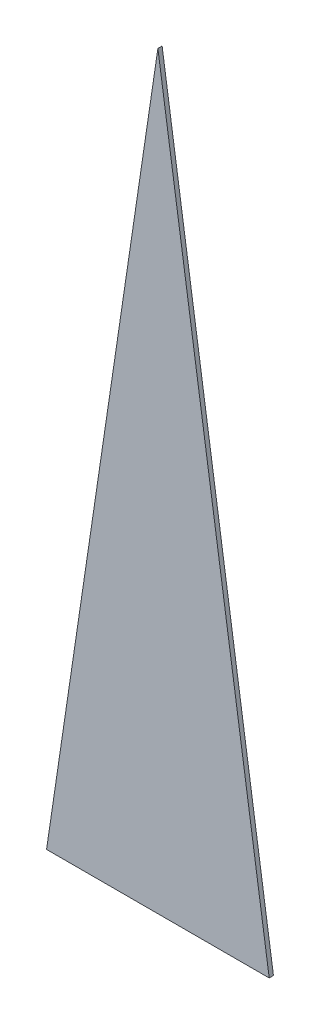
ISO-10303-21;
HEADER;
FILE_DESCRIPTION(('STEP AP214'),'2;1');
FILE_NAME('part.step','',(''),(''),'','','');
FILE_SCHEMA(('AUTOMOTIVE_DESIGN { 1 0 10303 214 1 1 1 1 }'));
ENDSEC;
DATA;
#1=APPLICATION_CONTEXT('core data for automotive mechanical design processes');
#2=APPLICATION_PROTOCOL_DEFINITION('international standard','automotive_design',2000,#1);
#3=PRODUCT_CONTEXT('',#1,'mechanical');
#4=PRODUCT('Part','Part','',(#3));
#5=PRODUCT_RELATED_PRODUCT_CATEGORY('part','',(#4));
#6=PRODUCT_DEFINITION_FORMATION('','',#4);
#7=PRODUCT_DEFINITION_CONTEXT('part definition',#1,'design');
#8=PRODUCT_DEFINITION('design','',#6,#7);
#9=PRODUCT_DEFINITION_SHAPE('','',#8);
#10=(LENGTH_UNIT() NAMED_UNIT(*) SI_UNIT(.MILLI.,.METRE.));
#11=(NAMED_UNIT(*) PLANE_ANGLE_UNIT() SI_UNIT($,.RADIAN.));
#12=(NAMED_UNIT(*) SI_UNIT($,.STERADIAN.) SOLID_ANGLE_UNIT());
#13=UNCERTAINTY_MEASURE_WITH_UNIT(LENGTH_MEASURE(1.E-05),#10,'distance_accuracy_value','');
#14=(GEOMETRIC_REPRESENTATION_CONTEXT(3) GLOBAL_UNCERTAINTY_ASSIGNED_CONTEXT((#13)) GLOBAL_UNIT_ASSIGNED_CONTEXT((#10,
#11,#12)) REPRESENTATION_CONTEXT('',''));
#15=CARTESIAN_POINT('',(0.,0.,0.));
#16=DIRECTION('',(0.,0.,1.));
#17=DIRECTION('',(1.,0.,0.));
#18=AXIS2_PLACEMENT_3D('',#15,#16,#17);
#19=CARTESIAN_POINT('',(0.,0.,0.));
#20=DIRECTION('',(0.,0.,-1.));
#21=DIRECTION('',(-1.,0.,0.));
#22=AXIS2_PLACEMENT_3D('',#19,#20,#21);
#23=PLANE('',#22);
#24=DIRECTION('',(1.,0.,0.));
#25=VECTOR('',#24,1.);
#26=CARTESIAN_POINT('',(-26.305,-177.056620816619,0.));
#27=LINE('',#26,#25);
#28=CARTESIAN_POINT('',(26.305,-177.056620816619,0.));
#29=VERTEX_POINT('',#28);
#30=CARTESIAN_POINT('',(-26.305,-177.056620816619,0.));
#31=VERTEX_POINT('',#30);
#32=EDGE_CURVE('E19',#29,#31,#27,.F.);
#33=ORIENTED_EDGE('',*,*,#32,.T.);
#34=DIRECTION('',(0.14695530726257,0.989143133053737,0.));
#35=VECTOR('',#34,1.);
#36=CARTESIAN_POINT('',(0.,0.,0.));
#37=LINE('',#36,#35);
#38=CARTESIAN_POINT('',(0.,0.,0.));
#39=VERTEX_POINT('',#38);
#40=EDGE_CURVE('E53',#31,#39,#37,.T.);
#41=ORIENTED_EDGE('',*,*,#40,.T.);
#42=DIRECTION('',(0.14695530726257,-0.989143133053737,0.));
#43=VECTOR('',#42,1.);
#44=CARTESIAN_POINT('',(26.305,-177.056620816619,0.));
#45=LINE('',#44,#43);
#46=EDGE_CURVE('E54',#39,#29,#45,.T.);
#47=ORIENTED_EDGE('',*,*,#46,.T.);
#48=EDGE_LOOP('',(#33,#41,#47));
#49=FACE_BOUND('',#48,.T.);
#50=ADVANCED_FACE('F16',(#49),#23,.T.);
#51=CARTESIAN_POINT('',(-26.305,-177.056620816619,1.));
#52=DIRECTION('',(0.,1.,0.));
#53=DIRECTION('',(0.,0.,1.));
#54=AXIS2_PLACEMENT_3D('',#51,#52,#53);
#55=PLANE('',#54);
#56=DIRECTION('',(0.,0.,1.));
#57=VECTOR('',#56,1.);
#58=CARTESIAN_POINT('',(26.305,-177.056620816619,1.));
#59=LINE('',#58,#57);
#60=CARTESIAN_POINT('',(26.305,-177.056620816619,1.));
#61=VERTEX_POINT('',#60);
#62=EDGE_CURVE('E60',#29,#61,#59,.T.);
#63=ORIENTED_EDGE('',*,*,#62,.T.);
#64=DIRECTION('',(-1.,0.,0.));
#65=VECTOR('',#64,1.);
#66=CARTESIAN_POINT('',(0.,-177.056620816619,1.));
#67=LINE('',#66,#65);
#68=CARTESIAN_POINT('',(-26.305,-177.056620816619,1.));
#69=VERTEX_POINT('',#68);
#70=EDGE_CURVE('E64',#61,#69,#67,.T.);
#71=ORIENTED_EDGE('',*,*,#70,.T.);
#72=DIRECTION('',(0.,0.,1.));
#73=VECTOR('',#72,1.);
#74=CARTESIAN_POINT('',(-26.305,-177.056620816619,1.));
#75=LINE('',#74,#73);
#76=EDGE_CURVE('E55',#69,#31,#75,.F.);
#77=ORIENTED_EDGE('',*,*,#76,.T.);
#78=ORIENTED_EDGE('',*,*,#32,.F.);
#79=EDGE_LOOP('',(#63,#71,#77,#78));
#80=FACE_BOUND('',#79,.T.);
#81=ADVANCED_FACE('F63',(#80),#55,.F.);
#82=CARTESIAN_POINT('',(0.,0.,1.));
#83=DIRECTION('',(0.989143133053737,-0.14695530726257,0.));
#84=DIRECTION('',(0.14695530726257,0.989143133053737,0.));
#85=AXIS2_PLACEMENT_3D('',#82,#83,#84);
#86=PLANE('',#85);
#87=ORIENTED_EDGE('',*,*,#76,.F.);
#88=DIRECTION('',(0.14695530726257,0.989143133053737,0.));
#89=VECTOR('',#88,1.);
#90=CARTESIAN_POINT('',(-26.305,-177.056620816619,1.));
#91=LINE('',#90,#89);
#92=CARTESIAN_POINT('',(0.,1.12233147916488E-13,1.));
#93=VERTEX_POINT('',#92);
#94=EDGE_CURVE('E25',#69,#93,#91,.T.);
#95=ORIENTED_EDGE('',*,*,#94,.T.);
#96=DIRECTION('',(0.,0.,1.));
#97=VECTOR('',#96,1.);
#98=CARTESIAN_POINT('',(0.,0.,1.));
#99=LINE('',#98,#97);
#100=EDGE_CURVE('E33',#93,#39,#99,.F.);
#101=ORIENTED_EDGE('',*,*,#100,.T.);
#102=ORIENTED_EDGE('',*,*,#40,.F.);
#103=EDGE_LOOP('',(#87,#95,#101,#102));
#104=FACE_BOUND('',#103,.T.);
#105=ADVANCED_FACE('F57',(#104),#86,.F.);
#106=CARTESIAN_POINT('',(26.305,-177.056620816619,1.));
#107=DIRECTION('',(-0.989143133053737,-0.14695530726257,0.));
#108=DIRECTION('',(0.14695530726257,-0.989143133053737,0.));
#109=AXIS2_PLACEMENT_3D('',#106,#107,#108);
#110=PLANE('',#109);
#111=ORIENTED_EDGE('',*,*,#100,.F.);
#112=DIRECTION('',(0.14695530726257,-0.989143133053737,0.));
#113=VECTOR('',#112,1.);
#114=CARTESIAN_POINT('',(0.,0.,1.));
#115=LINE('',#114,#113);
#116=EDGE_CURVE('E11',#93,#61,#115,.T.);
#117=ORIENTED_EDGE('',*,*,#116,.T.);
#118=ORIENTED_EDGE('',*,*,#62,.F.);
#119=ORIENTED_EDGE('',*,*,#46,.F.);
#120=EDGE_LOOP('',(#111,#117,#118,#119));
#121=FACE_BOUND('',#120,.T.);
#122=ADVANCED_FACE('F72',(#121),#110,.F.);
#123=CARTESIAN_POINT('',(0.,0.,1.));
#124=DIRECTION('',(0.,0.,-1.));
#125=DIRECTION('',(-1.,0.,0.));
#126=AXIS2_PLACEMENT_3D('',#123,#124,#125);
#127=PLANE('',#126);
#128=ORIENTED_EDGE('',*,*,#94,.F.);
#129=ORIENTED_EDGE('',*,*,#70,.F.);
#130=ORIENTED_EDGE('',*,*,#116,.F.);
#131=EDGE_LOOP('',(#128,#129,#130));
#132=FACE_BOUND('',#131,.T.);
#133=ADVANCED_FACE('F71',(#132),#127,.F.);
#134=CLOSED_SHELL('',(#50,#81,#105,#122,#133));
#135=MANIFOLD_SOLID_BREP('B1',#134);
#136=ADVANCED_BREP_SHAPE_REPRESENTATION('',(#18,#135),#14);
#137=SHAPE_DEFINITION_REPRESENTATION(#9,#136);
ENDSEC;
END-ISO-10303-21;
